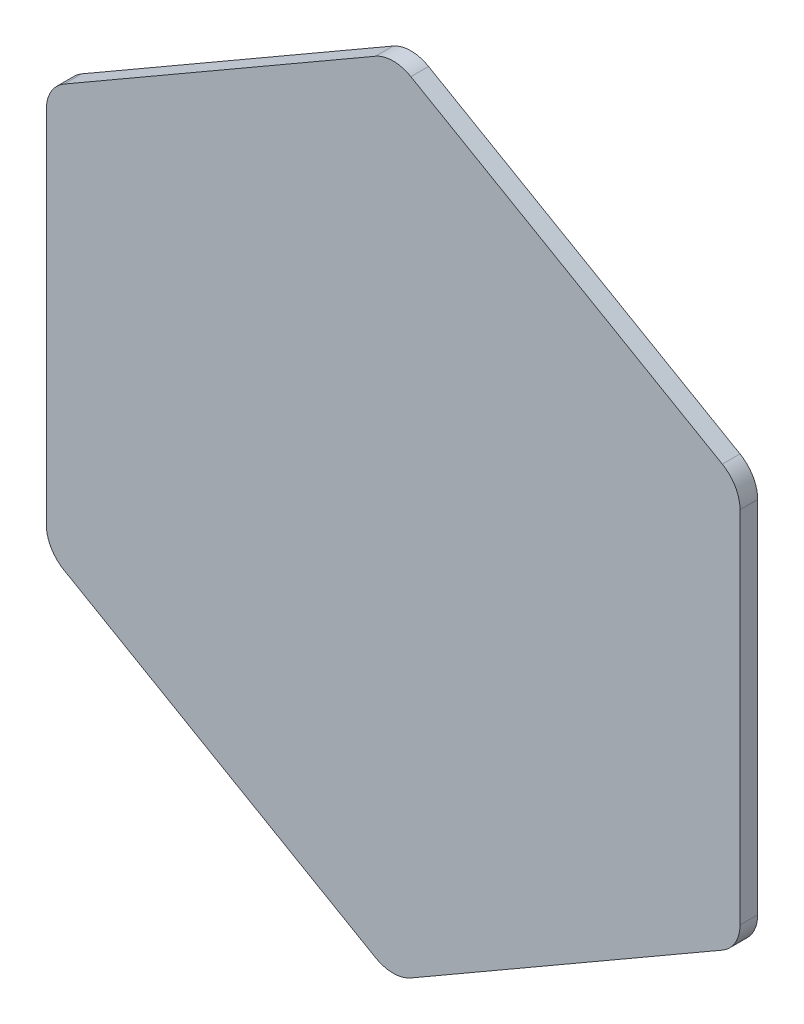
ISO-10303-21;
HEADER;
FILE_DESCRIPTION(('STEP AP214'),'2;1');
FILE_NAME('part.step','',(''),(''),'','','');
FILE_SCHEMA(('AUTOMOTIVE_DESIGN { 1 0 10303 214 1 1 1 1 }'));
ENDSEC;
DATA;
#1=APPLICATION_CONTEXT('core data for automotive mechanical design processes');
#2=APPLICATION_PROTOCOL_DEFINITION('international standard','automotive_design',2000,#1);
#3=PRODUCT_CONTEXT('',#1,'mechanical');
#4=PRODUCT('Part','Part','',(#3));
#5=PRODUCT_RELATED_PRODUCT_CATEGORY('part','',(#4));
#6=PRODUCT_DEFINITION_FORMATION('','',#4);
#7=PRODUCT_DEFINITION_CONTEXT('part definition',#1,'design');
#8=PRODUCT_DEFINITION('design','',#6,#7);
#9=PRODUCT_DEFINITION_SHAPE('','',#8);
#10=(LENGTH_UNIT() NAMED_UNIT(*) SI_UNIT(.MILLI.,.METRE.));
#11=(NAMED_UNIT(*) PLANE_ANGLE_UNIT() SI_UNIT($,.RADIAN.));
#12=(NAMED_UNIT(*) SI_UNIT($,.STERADIAN.) SOLID_ANGLE_UNIT());
#13=UNCERTAINTY_MEASURE_WITH_UNIT(LENGTH_MEASURE(1.E-05),#10,'distance_accuracy_value','');
#14=(GEOMETRIC_REPRESENTATION_CONTEXT(3) GLOBAL_UNCERTAINTY_ASSIGNED_CONTEXT((#13)) GLOBAL_UNIT_ASSIGNED_CONTEXT((#10,
#11,#12)) REPRESENTATION_CONTEXT('',''));
#15=CARTESIAN_POINT('',(0.,0.,0.));
#16=DIRECTION('',(0.,0.,1.));
#17=DIRECTION('',(1.,0.,0.));
#18=AXIS2_PLACEMENT_3D('',#15,#16,#17);
#19=CARTESIAN_POINT('',(0.,0.,0.));
#20=DIRECTION('',(0.,0.,1.));
#21=DIRECTION('',(1.,0.,0.));
#22=AXIS2_PLACEMENT_3D('',#19,#20,#21);
#23=PLANE('',#22);
#24=DIRECTION('',(0.,-1.,0.));
#25=VECTOR('',#24,1.);
#26=CARTESIAN_POINT('',(4.93445489885111,0.,0.));
#27=LINE('',#26,#25);
#28=CARTESIAN_POINT('',(4.93445489885104,6.0297366996516,0.));
#29=VERTEX_POINT('',#28);
#30=CARTESIAN_POINT('',(4.93445489885107,3.13854399058548,0.));
#31=VERTEX_POINT('',#30);
#32=EDGE_CURVE('E255',#29,#31,#27,.T.);
#33=ORIENTED_EDGE('',*,*,#32,.F.);
#34=DIRECTION('',(-0.930801999936379,-0.365523784334806,0.));
#35=VECTOR('',#34,1.);
#36=CARTESIAN_POINT('',(-1.39221808373856,3.54526690800636,0.));
#37=LINE('',#36,#35);
#38=CARTESIAN_POINT('',(-1.55080949137151,3.48298843043009,0.));
#39=VERTEX_POINT('',#38);
#40=EDGE_CURVE('E271',#29,#39,#37,.T.);
#41=ORIENTED_EDGE('',*,*,#40,.T.);
#42=CARTESIAN_POINT('',(0.251075484721764,-1.10549038075091,0.));
#43=DIRECTION('',(0.,0.,1.));
#44=DIRECTION('',(1.,0.,0.));
#45=AXIS2_PLACEMENT_3D('',#42,#43,#44);
#46=CIRCLE('',#45,4.92959706951062);
#47=CARTESIAN_POINT('',(4.03712241839969,2.05152971480054,0.));
#48=VERTEX_POINT('',#47);
#49=EDGE_CURVE('E233',#39,#48,#46,.T.);
#50=ORIENTED_EDGE('',*,*,#49,.T.);
#51=DIRECTION('',(-0.93394817059287,-0.357408470305659,0.));
#52=VECTOR('',#51,1.);
#53=CARTESIAN_POINT('',(-0.169097337099857,0.441870189873999,0.));
#54=LINE('',#53,#52);
#55=CARTESIAN_POINT('',(1.14629572943802,0.945252110375574,0.));
#56=VERTEX_POINT('',#55);
#57=EDGE_CURVE('E95',#48,#56,#54,.T.);
#58=ORIENTED_EDGE('',*,*,#57,.T.);
#59=CARTESIAN_POINT('',(0.262460127323231,-1.10555132052141,0.));
#60=DIRECTION('',(0.,0.,1.));
#61=DIRECTION('',(1.,0.,0.));
#62=AXIS2_PLACEMENT_3D('',#59,#60,#61);
#63=CIRCLE('',#62,2.23315026000144);
#64=CARTESIAN_POINT('',(-0.277756055893655,1.06127275151006,0.));
#65=VERTEX_POINT('',#64);
#66=EDGE_CURVE('E278',#65,#56,#63,.T.);
#67=ORIENTED_EDGE('',*,*,#66,.F.);
#68=DIRECTION('',(-0.928943832980867,-0.37022068441244,0.));
#69=VECTOR('',#68,1.);
#70=CARTESIAN_POINT('',(-0.403056969208098,1.01133540520579,0.));
#71=LINE('',#70,#69);
#72=EDGE_CURVE('E258',#31,#65,#71,.T.);
#73=ORIENTED_EDGE('',*,*,#72,.F.);
#74=EDGE_LOOP('',(#33,#41,#50,#58,#67,#73));
#75=FACE_BOUND('',#74,.T.);
#76=DIRECTION('',(-0.866025403784439,0.5,0.));
#77=VECTOR('',#76,1.);
#78=CARTESIAN_POINT('',(9.80340757083983,5.66,0.));
#79=LINE('',#78,#77);
#80=CARTESIAN_POINT('',(9.30340757083983,5.94867513459482,0.));
#81=VERTEX_POINT('',#80);
#82=CARTESIAN_POINT('',(0.499999999999999,11.0313248654052,0.));
#83=VERTEX_POINT('',#82);
#84=EDGE_CURVE('E330',#81,#83,#79,.T.);
#85=ORIENTED_EDGE('',*,*,#84,.F.);
#86=CARTESIAN_POINT('',(8.80340757083983,5.08264973081038,0.));
#87=DIRECTION('',(0.,0.,1.));
#88=DIRECTION('',(1.,0.,0.));
#89=AXIS2_PLACEMENT_3D('',#86,#87,#88);
#90=CIRCLE('',#89,1.);
#91=CARTESIAN_POINT('',(9.80340757083983,5.08264973081038,0.));
#92=VERTEX_POINT('',#91);
#93=EDGE_CURVE('E411',#81,#92,#90,.F.);
#94=ORIENTED_EDGE('',*,*,#93,.T.);
#95=DIRECTION('',(0.,1.,0.));
#96=VECTOR('',#95,1.);
#97=CARTESIAN_POINT('',(9.80340757083983,-5.65999999999999,0.));
#98=LINE('',#97,#96);
#99=CARTESIAN_POINT('',(9.80340757083983,-5.08264973081036,0.));
#100=VERTEX_POINT('',#99);
#101=EDGE_CURVE('E347',#100,#92,#98,.T.);
#102=ORIENTED_EDGE('',*,*,#101,.F.);
#103=CARTESIAN_POINT('',(8.80340757083983,-5.08264973081036,0.));
#104=DIRECTION('',(0.,0.,1.));
#105=DIRECTION('',(1.,0.,0.));
#106=AXIS2_PLACEMENT_3D('',#103,#104,#105);
#107=CIRCLE('',#106,1.);
#108=CARTESIAN_POINT('',(9.30340757083983,-5.9486751345948,0.));
#109=VERTEX_POINT('',#108);
#110=EDGE_CURVE('E408',#100,#109,#107,.F.);
#111=ORIENTED_EDGE('',*,*,#110,.T.);
#112=DIRECTION('',(0.866025403784439,0.5,0.));
#113=VECTOR('',#112,1.);
#114=CARTESIAN_POINT('',(0.,-11.32,0.));
#115=LINE('',#114,#113);
#116=CARTESIAN_POINT('',(0.499999999999987,-11.0313248654052,0.));
#117=VERTEX_POINT('',#116);
#118=EDGE_CURVE('E383',#117,#109,#115,.T.);
#119=ORIENTED_EDGE('',*,*,#118,.F.);
#120=CARTESIAN_POINT('',(0.,-10.1652994616207,0.));
#121=DIRECTION('',(0.,0.,1.));
#122=DIRECTION('',(1.,0.,0.));
#123=AXIS2_PLACEMENT_3D('',#120,#121,#122);
#124=CIRCLE('',#123,1.);
#125=CARTESIAN_POINT('',(-0.500000000000016,-11.0313248654052,0.));
#126=VERTEX_POINT('',#125);
#127=EDGE_CURVE('E405',#117,#126,#124,.F.);
#128=ORIENTED_EDGE('',*,*,#127,.T.);
#129=DIRECTION('',(0.866025403784438,-0.5,0.));
#130=VECTOR('',#129,1.);
#131=CARTESIAN_POINT('',(-9.80340757083984,-5.65999999999999,0.));
#132=LINE('',#131,#130);
#133=CARTESIAN_POINT('',(-9.30340757083984,-5.94867513459481,0.));
#134=VERTEX_POINT('',#133);
#135=EDGE_CURVE('E379',#134,#126,#132,.T.);
#136=ORIENTED_EDGE('',*,*,#135,.F.);
#137=CARTESIAN_POINT('',(-8.80340757083984,-5.08264973081037,0.));
#138=DIRECTION('',(0.,0.,1.));
#139=DIRECTION('',(1.,0.,0.));
#140=AXIS2_PLACEMENT_3D('',#137,#138,#139);
#141=CIRCLE('',#140,1.);
#142=CARTESIAN_POINT('',(-9.80340757083984,-5.08264973081037,0.));
#143=VERTEX_POINT('',#142);
#144=EDGE_CURVE('E402',#134,#143,#141,.F.);
#145=ORIENTED_EDGE('',*,*,#144,.T.);
#146=DIRECTION('',(0.,-1.,0.));
#147=VECTOR('',#146,1.);
#148=CARTESIAN_POINT('',(-9.80340757083984,5.66,0.));
#149=LINE('',#148,#147);
#150=CARTESIAN_POINT('',(-9.80340757083984,5.08264973081037,0.));
#151=VERTEX_POINT('',#150);
#152=EDGE_CURVE('E375',#151,#143,#149,.T.);
#153=ORIENTED_EDGE('',*,*,#152,.F.);
#154=CARTESIAN_POINT('',(-8.80340757083984,5.08264973081037,0.));
#155=DIRECTION('',(0.,0.,1.));
#156=DIRECTION('',(1.,0.,0.));
#157=AXIS2_PLACEMENT_3D('',#154,#155,#156);
#158=CIRCLE('',#157,1.);
#159=CARTESIAN_POINT('',(-9.30340757083984,5.94867513459481,0.));
#160=VERTEX_POINT('',#159);
#161=EDGE_CURVE('E399',#151,#160,#158,.F.);
#162=ORIENTED_EDGE('',*,*,#161,.T.);
#163=DIRECTION('',(-0.866025403784439,-0.5,0.));
#164=VECTOR('',#163,1.);
#165=CARTESIAN_POINT('',(0.,11.32,0.));
#166=LINE('',#165,#164);
#167=CARTESIAN_POINT('',(-0.500000000000001,11.0313248654052,0.));
#168=VERTEX_POINT('',#167);
#169=EDGE_CURVE('E371',#168,#160,#166,.T.);
#170=ORIENTED_EDGE('',*,*,#169,.F.);
#171=CARTESIAN_POINT('',(0.,10.1652994616207,0.));
#172=DIRECTION('',(0.,0.,1.));
#173=DIRECTION('',(1.,0.,0.));
#174=AXIS2_PLACEMENT_3D('',#171,#172,#173);
#175=CIRCLE('',#174,1.);
#176=EDGE_CURVE('E396',#168,#83,#175,.F.);
#177=ORIENTED_EDGE('',*,*,#176,.T.);
#178=EDGE_LOOP('',(#85,#94,#102,#111,#119,#128,#136,#145,#153,#162,#170,#177));
#179=FACE_BOUND('',#178,.T.);
#180=CARTESIAN_POINT('',(1.50162423897402,-2.72281707378858,0.));
#181=DIRECTION('',(0.,0.,1.));
#182=DIRECTION('',(1.,0.,0.));
#183=AXIS2_PLACEMENT_3D('',#180,#181,#182);
#184=CIRCLE('',#183,7.6439857574976);
#185=CARTESIAN_POINT('',(-0.705543929440594,4.59557939928961,0.));
#186=VERTEX_POINT('',#185);
#187=CARTESIAN_POINT('',(-3.71178768308495,2.86742928856073,0.));
#188=VERTEX_POINT('',#187);
#189=EDGE_CURVE('E286',#186,#188,#184,.T.);
#190=ORIENTED_EDGE('',*,*,#189,.F.);
#191=DIRECTION('',(0.93075351304519,-0.36564723156895,0.));
#192=VECTOR('',#191,1.);
#193=CARTESIAN_POINT('',(1.46967205643605,3.74104413065754,0.));
#194=LINE('',#193,#192);
#195=CARTESIAN_POINT('',(-6.66156274128962,6.93540595831056,0.));
#196=VERTEX_POINT('',#195);
#197=EDGE_CURVE('E317',#196,#186,#194,.T.);
#198=ORIENTED_EDGE('',*,*,#197,.F.);
#199=DIRECTION('',(0.,1.,0.));
#200=VECTOR('',#199,1.);
#201=CARTESIAN_POINT('',(-6.66156274128962,0.,0.));
#202=LINE('',#201,#200);
#203=CARTESIAN_POINT('',(-6.66156274128962,4.02625068291126,0.));
#204=VERTEX_POINT('',#203);
#205=EDGE_CURVE('E321',#204,#196,#202,.T.);
#206=ORIENTED_EDGE('',*,*,#205,.F.);
#207=DIRECTION('',(0.93075351304519,-0.365647231568951,0.));
#208=VECTOR('',#207,1.);
#209=CARTESIAN_POINT('',(0.479606673525878,1.22083680040102,0.));
#210=LINE('',#209,#208);
#211=EDGE_CURVE('E103',#204,#188,#210,.T.);
#212=ORIENTED_EDGE('',*,*,#211,.T.);
#213=EDGE_LOOP('',(#190,#198,#206,#212));
#214=FACE_BOUND('',#213,.T.);
#215=ADVANCED_FACE('F79',(#75,#179,#214),#23,.F.);
#216=CARTESIAN_POINT('',(9.80340757083983,5.66,0.5));
#217=DIRECTION('',(-0.5,-0.866025403784439,0.));
#218=DIRECTION('',(0.866025403784439,-0.5,0.));
#219=AXIS2_PLACEMENT_3D('',#216,#217,#218);
#220=PLANE('',#219);
#221=DIRECTION('',(-0.866025403784439,0.5,0.));
#222=VECTOR('',#221,1.);
#223=CARTESIAN_POINT('',(9.80340757083983,5.66,0.5));
#224=LINE('',#223,#222);
#225=CARTESIAN_POINT('',(9.30340757083983,5.94867513459482,0.5));
#226=VERTEX_POINT('',#225);
#227=CARTESIAN_POINT('',(0.499999999999999,11.0313248654052,0.5));
#228=VERTEX_POINT('',#227);
#229=EDGE_CURVE('E342',#226,#228,#224,.T.);
#230=ORIENTED_EDGE('',*,*,#229,.F.);
#231=DIRECTION('',(0.,0.,-1.));
#232=VECTOR('',#231,1.);
#233=CARTESIAN_POINT('',(9.30340757083983,5.94867513459482,0.5));
#234=LINE('',#233,#232);
#235=EDGE_CURVE('E392',#226,#81,#234,.T.);
#236=ORIENTED_EDGE('',*,*,#235,.T.);
#237=ORIENTED_EDGE('',*,*,#84,.T.);
#238=DIRECTION('',(0.,0.,-1.));
#239=VECTOR('',#238,1.);
#240=CARTESIAN_POINT('',(0.499999999999999,11.0313248654052,0.5));
#241=LINE('',#240,#239);
#242=EDGE_CURVE('E367',#83,#228,#241,.F.);
#243=ORIENTED_EDGE('',*,*,#242,.T.);
#244=EDGE_LOOP('',(#230,#236,#237,#243));
#245=FACE_BOUND('',#244,.T.);
#246=ADVANCED_FACE('F515',(#245),#220,.F.);
#247=CARTESIAN_POINT('',(0.,11.32,0.5));
#248=DIRECTION('',(0.5,-0.866025403784439,0.));
#249=DIRECTION('',(0.866025403784439,0.5,0.));
#250=AXIS2_PLACEMENT_3D('',#247,#248,#249);
#251=PLANE('',#250);
#252=ORIENTED_EDGE('',*,*,#169,.T.);
#253=DIRECTION('',(0.,0.,-1.));
#254=VECTOR('',#253,1.);
#255=CARTESIAN_POINT('',(-9.30340757083984,5.94867513459481,0.5));
#256=LINE('',#255,#254);
#257=CARTESIAN_POINT('',(-9.30340757083984,5.94867513459481,0.5));
#258=VERTEX_POINT('',#257);
#259=EDGE_CURVE('E12',#160,#258,#256,.F.);
#260=ORIENTED_EDGE('',*,*,#259,.T.);
#261=DIRECTION('',(-0.866025403784439,-0.5,0.));
#262=VECTOR('',#261,1.);
#263=CARTESIAN_POINT('',(0.,11.32,0.5));
#264=LINE('',#263,#262);
#265=CARTESIAN_POINT('',(-0.500000000000001,11.0313248654052,0.5));
#266=VERTEX_POINT('',#265);
#267=EDGE_CURVE('E346',#266,#258,#264,.T.);
#268=ORIENTED_EDGE('',*,*,#267,.F.);
#269=DIRECTION('',(0.,0.,-1.));
#270=VECTOR('',#269,1.);
#271=CARTESIAN_POINT('',(-0.500000000000001,11.0313248654052,0.5));
#272=LINE('',#271,#270);
#273=EDGE_CURVE('E88',#266,#168,#272,.T.);
#274=ORIENTED_EDGE('',*,*,#273,.T.);
#275=EDGE_LOOP('',(#252,#260,#268,#274));
#276=FACE_BOUND('',#275,.T.);
#277=ADVANCED_FACE('F465',(#276),#251,.F.);
#278=CARTESIAN_POINT('',(-9.80340757083984,5.66,0.5));
#279=DIRECTION('',(1.,0.,0.));
#280=DIRECTION('',(0.,0.,-1.));
#281=AXIS2_PLACEMENT_3D('',#278,#279,#280);
#282=PLANE('',#281);
#283=ORIENTED_EDGE('',*,*,#152,.T.);
#284=DIRECTION('',(0.,0.,-1.));
#285=VECTOR('',#284,1.);
#286=CARTESIAN_POINT('',(-9.80340757083984,-5.08264973081037,0.5));
#287=LINE('',#286,#285);
#288=CARTESIAN_POINT('',(-9.80340757083984,-5.08264973081037,0.5));
#289=VERTEX_POINT('',#288);
#290=EDGE_CURVE('E457',#143,#289,#287,.F.);
#291=ORIENTED_EDGE('',*,*,#290,.T.);
#292=DIRECTION('',(0.,-1.,0.));
#293=VECTOR('',#292,1.);
#294=CARTESIAN_POINT('',(-9.80340757083984,5.66,0.5));
#295=LINE('',#294,#293);
#296=CARTESIAN_POINT('',(-9.80340757083984,5.08264973081037,0.5));
#297=VERTEX_POINT('',#296);
#298=EDGE_CURVE('E351',#297,#289,#295,.T.);
#299=ORIENTED_EDGE('',*,*,#298,.F.);
#300=DIRECTION('',(0.,0.,-1.));
#301=VECTOR('',#300,1.);
#302=CARTESIAN_POINT('',(-9.80340757083984,5.08264973081037,0.5));
#303=LINE('',#302,#301);
#304=EDGE_CURVE('E453',#297,#151,#303,.T.);
#305=ORIENTED_EDGE('',*,*,#304,.T.);
#306=EDGE_LOOP('',(#283,#291,#299,#305));
#307=FACE_BOUND('',#306,.T.);
#308=ADVANCED_FACE('F478',(#307),#282,.F.);
#309=CARTESIAN_POINT('',(-9.80340757083984,-5.65999999999999,0.5));
#310=DIRECTION('',(0.5,0.866025403784439,0.));
#311=DIRECTION('',(-0.866025403784439,0.5,0.));
#312=AXIS2_PLACEMENT_3D('',#309,#310,#311);
#313=PLANE('',#312);
#314=ORIENTED_EDGE('',*,*,#135,.T.);
#315=DIRECTION('',(0.,0.,-1.));
#316=VECTOR('',#315,1.);
#317=CARTESIAN_POINT('',(-0.500000000000013,-11.0313248654052,0.5));
#318=LINE('',#317,#316);
#319=CARTESIAN_POINT('',(-0.500000000000016,-11.0313248654052,0.5));
#320=VERTEX_POINT('',#319);
#321=EDGE_CURVE('E450',#126,#320,#318,.F.);
#322=ORIENTED_EDGE('',*,*,#321,.T.);
#323=DIRECTION('',(0.866025403784438,-0.5,0.));
#324=VECTOR('',#323,1.);
#325=CARTESIAN_POINT('',(-9.80340757083984,-5.65999999999999,0.5));
#326=LINE('',#325,#324);
#327=CARTESIAN_POINT('',(-9.30340757083984,-5.94867513459481,0.5));
#328=VERTEX_POINT('',#327);
#329=EDGE_CURVE('E355',#328,#320,#326,.T.);
#330=ORIENTED_EDGE('',*,*,#329,.F.);
#331=DIRECTION('',(0.,0.,-1.));
#332=VECTOR('',#331,1.);
#333=CARTESIAN_POINT('',(-9.30340757083984,-5.94867513459481,0.5));
#334=LINE('',#333,#332);
#335=EDGE_CURVE('E446',#328,#134,#334,.T.);
#336=ORIENTED_EDGE('',*,*,#335,.T.);
#337=EDGE_LOOP('',(#314,#322,#330,#336));
#338=FACE_BOUND('',#337,.T.);
#339=ADVANCED_FACE('F489',(#338),#313,.F.);
#340=CARTESIAN_POINT('',(0.,-11.32,0.5));
#341=DIRECTION('',(-0.5,0.866025403784439,0.));
#342=DIRECTION('',(-0.866025403784439,-0.5,0.));
#343=AXIS2_PLACEMENT_3D('',#340,#341,#342);
#344=PLANE('',#343);
#345=ORIENTED_EDGE('',*,*,#118,.T.);
#346=DIRECTION('',(0.,0.,-1.));
#347=VECTOR('',#346,1.);
#348=CARTESIAN_POINT('',(9.30340757083983,-5.9486751345948,0.5));
#349=LINE('',#348,#347);
#350=CARTESIAN_POINT('',(9.30340757083983,-5.9486751345948,0.5));
#351=VERTEX_POINT('',#350);
#352=EDGE_CURVE('E443',#109,#351,#349,.F.);
#353=ORIENTED_EDGE('',*,*,#352,.T.);
#354=DIRECTION('',(0.866025403784439,0.5,0.));
#355=VECTOR('',#354,1.);
#356=CARTESIAN_POINT('',(0.,-11.32,0.5));
#357=LINE('',#356,#355);
#358=CARTESIAN_POINT('',(0.499999999999987,-11.0313248654052,0.5));
#359=VERTEX_POINT('',#358);
#360=EDGE_CURVE('E359',#359,#351,#357,.T.);
#361=ORIENTED_EDGE('',*,*,#360,.F.);
#362=DIRECTION('',(0.,0.,-1.));
#363=VECTOR('',#362,1.);
#364=CARTESIAN_POINT('',(0.499999999999987,-11.0313248654052,0.5));
#365=LINE('',#364,#363);
#366=EDGE_CURVE('E439',#359,#117,#365,.T.);
#367=ORIENTED_EDGE('',*,*,#366,.T.);
#368=EDGE_LOOP('',(#345,#353,#361,#367));
#369=FACE_BOUND('',#368,.T.);
#370=ADVANCED_FACE('F498',(#369),#344,.F.);
#371=CARTESIAN_POINT('',(9.80340757083983,-5.65999999999999,0.5));
#372=DIRECTION('',(-1.,0.,0.));
#373=DIRECTION('',(0.,-1.,0.));
#374=AXIS2_PLACEMENT_3D('',#371,#372,#373);
#375=PLANE('',#374);
#376=ORIENTED_EDGE('',*,*,#101,.T.);
#377=DIRECTION('',(0.,0.,-1.));
#378=VECTOR('',#377,1.);
#379=CARTESIAN_POINT('',(9.80340757083983,5.08264973081038,0.5));
#380=LINE('',#379,#378);
#381=CARTESIAN_POINT('',(9.80340757083983,5.08264973081038,0.5));
#382=VERTEX_POINT('',#381);
#383=EDGE_CURVE('E418',#92,#382,#380,.F.);
#384=ORIENTED_EDGE('',*,*,#383,.T.);
#385=DIRECTION('',(0.,1.,0.));
#386=VECTOR('',#385,1.);
#387=CARTESIAN_POINT('',(9.80340757083983,-5.65999999999999,0.5));
#388=LINE('',#387,#386);
#389=CARTESIAN_POINT('',(9.80340757083983,-5.08264973081036,0.5));
#390=VERTEX_POINT('',#389);
#391=EDGE_CURVE('E363',#390,#382,#388,.T.);
#392=ORIENTED_EDGE('',*,*,#391,.F.);
#393=DIRECTION('',(0.,0.,-1.));
#394=VECTOR('',#393,1.);
#395=CARTESIAN_POINT('',(9.80340757083983,-5.08264973081036,0.5));
#396=LINE('',#395,#394);
#397=EDGE_CURVE('E414',#390,#100,#396,.T.);
#398=ORIENTED_EDGE('',*,*,#397,.T.);
#399=EDGE_LOOP('',(#376,#384,#392,#398));
#400=FACE_BOUND('',#399,.T.);
#401=ADVANCED_FACE('F507',(#400),#375,.F.);
#402=CARTESIAN_POINT('',(0.,0.,0.5));
#403=DIRECTION('',(0.,0.,1.));
#404=DIRECTION('',(1.,0.,0.));
#405=AXIS2_PLACEMENT_3D('',#402,#403,#404);
#406=PLANE('',#405);
#407=ORIENTED_EDGE('',*,*,#391,.T.);
#408=CARTESIAN_POINT('',(8.80340757083983,5.08264973081038,0.5));
#409=DIRECTION('',(0.,0.,1.));
#410=DIRECTION('',(1.,0.,0.));
#411=AXIS2_PLACEMENT_3D('',#408,#409,#410);
#412=CIRCLE('',#411,1.);
#413=EDGE_CURVE('E436',#382,#226,#412,.T.);
#414=ORIENTED_EDGE('',*,*,#413,.T.);
#415=ORIENTED_EDGE('',*,*,#229,.T.);
#416=CARTESIAN_POINT('',(0.,10.1652994616207,0.5));
#417=DIRECTION('',(0.,0.,1.));
#418=DIRECTION('',(1.,0.,0.));
#419=AXIS2_PLACEMENT_3D('',#416,#417,#418);
#420=CIRCLE('',#419,1.);
#421=EDGE_CURVE('E421',#228,#266,#420,.T.);
#422=ORIENTED_EDGE('',*,*,#421,.T.);
#423=ORIENTED_EDGE('',*,*,#267,.T.);
#424=CARTESIAN_POINT('',(-8.80340757083984,5.08264973081037,0.5));
#425=DIRECTION('',(0.,0.,1.));
#426=DIRECTION('',(1.,0.,0.));
#427=AXIS2_PLACEMENT_3D('',#424,#425,#426);
#428=CIRCLE('',#427,1.);
#429=EDGE_CURVE('E424',#258,#297,#428,.T.);
#430=ORIENTED_EDGE('',*,*,#429,.T.);
#431=ORIENTED_EDGE('',*,*,#298,.T.);
#432=CARTESIAN_POINT('',(-8.80340757083984,-5.08264973081037,0.5));
#433=DIRECTION('',(0.,0.,1.));
#434=DIRECTION('',(1.,0.,0.));
#435=AXIS2_PLACEMENT_3D('',#432,#433,#434);
#436=CIRCLE('',#435,1.);
#437=EDGE_CURVE('E427',#289,#328,#436,.T.);
#438=ORIENTED_EDGE('',*,*,#437,.T.);
#439=ORIENTED_EDGE('',*,*,#329,.T.);
#440=CARTESIAN_POINT('',(0.,-10.1652994616207,0.5));
#441=DIRECTION('',(0.,0.,1.));
#442=DIRECTION('',(1.,0.,0.));
#443=AXIS2_PLACEMENT_3D('',#440,#441,#442);
#444=CIRCLE('',#443,1.);
#445=EDGE_CURVE('E430',#320,#359,#444,.T.);
#446=ORIENTED_EDGE('',*,*,#445,.T.);
#447=ORIENTED_EDGE('',*,*,#360,.T.);
#448=CARTESIAN_POINT('',(8.80340757083983,-5.08264973081036,0.5));
#449=DIRECTION('',(0.,0.,1.));
#450=DIRECTION('',(1.,0.,0.));
#451=AXIS2_PLACEMENT_3D('',#448,#449,#450);
#452=CIRCLE('',#451,1.);
#453=EDGE_CURVE('E433',#351,#390,#452,.T.);
#454=ORIENTED_EDGE('',*,*,#453,.T.);
#455=EDGE_LOOP('',(#407,#414,#415,#422,#423,#430,#431,#438,#439,#446,#447,#454));
#456=FACE_BOUND('',#455,.T.);
#457=ADVANCED_FACE('F482',(#456),#406,.T.);
#458=CARTESIAN_POINT('',(8.80340757083983,5.08264973081038,0.5));
#459=DIRECTION('',(0.,0.,-1.));
#460=DIRECTION('',(-1.,0.,0.));
#461=AXIS2_PLACEMENT_3D('',#458,#459,#460);
#462=CYLINDRICAL_SURFACE('',#461,1.);
#463=ORIENTED_EDGE('',*,*,#413,.F.);
#464=ORIENTED_EDGE('',*,*,#383,.F.);
#465=ORIENTED_EDGE('',*,*,#93,.F.);
#466=ORIENTED_EDGE('',*,*,#235,.F.);
#467=EDGE_LOOP('',(#463,#464,#465,#466));
#468=FACE_BOUND('',#467,.T.);
#469=ADVANCED_FACE('F512',(#468),#462,.T.);
#470=CARTESIAN_POINT('',(8.80340757083983,-5.08264973081036,0.5));
#471=DIRECTION('',(0.,0.,-1.));
#472=DIRECTION('',(-1.,0.,0.));
#473=AXIS2_PLACEMENT_3D('',#470,#471,#472);
#474=CYLINDRICAL_SURFACE('',#473,1.);
#475=ORIENTED_EDGE('',*,*,#453,.F.);
#476=ORIENTED_EDGE('',*,*,#352,.F.);
#477=ORIENTED_EDGE('',*,*,#110,.F.);
#478=ORIENTED_EDGE('',*,*,#397,.F.);
#479=EDGE_LOOP('',(#475,#476,#477,#478));
#480=FACE_BOUND('',#479,.T.);
#481=ADVANCED_FACE('F504',(#480),#474,.T.);
#482=CARTESIAN_POINT('',(0.,-10.1652994616207,0.5));
#483=DIRECTION('',(0.,0.,-1.));
#484=DIRECTION('',(-1.,0.,0.));
#485=AXIS2_PLACEMENT_3D('',#482,#483,#484);
#486=CYLINDRICAL_SURFACE('',#485,1.);
#487=ORIENTED_EDGE('',*,*,#445,.F.);
#488=ORIENTED_EDGE('',*,*,#321,.F.);
#489=ORIENTED_EDGE('',*,*,#127,.F.);
#490=ORIENTED_EDGE('',*,*,#366,.F.);
#491=EDGE_LOOP('',(#487,#488,#489,#490));
#492=FACE_BOUND('',#491,.T.);
#493=ADVANCED_FACE('F495',(#492),#486,.T.);
#494=CARTESIAN_POINT('',(-8.80340757083984,-5.08264973081037,0.5));
#495=DIRECTION('',(0.,0.,-1.));
#496=DIRECTION('',(-1.,0.,0.));
#497=AXIS2_PLACEMENT_3D('',#494,#495,#496);
#498=CYLINDRICAL_SURFACE('',#497,1.);
#499=ORIENTED_EDGE('',*,*,#437,.F.);
#500=ORIENTED_EDGE('',*,*,#290,.F.);
#501=ORIENTED_EDGE('',*,*,#144,.F.);
#502=ORIENTED_EDGE('',*,*,#335,.F.);
#503=EDGE_LOOP('',(#499,#500,#501,#502));
#504=FACE_BOUND('',#503,.T.);
#505=ADVANCED_FACE('F486',(#504),#498,.T.);
#506=CARTESIAN_POINT('',(-8.80340757083984,5.08264973081037,0.5));
#507=DIRECTION('',(0.,0.,-1.));
#508=DIRECTION('',(-1.,0.,0.));
#509=AXIS2_PLACEMENT_3D('',#506,#507,#508);
#510=CYLINDRICAL_SURFACE('',#509,1.);
#511=ORIENTED_EDGE('',*,*,#429,.F.);
#512=ORIENTED_EDGE('',*,*,#259,.F.);
#513=ORIENTED_EDGE('',*,*,#161,.F.);
#514=ORIENTED_EDGE('',*,*,#304,.F.);
#515=EDGE_LOOP('',(#511,#512,#513,#514));
#516=FACE_BOUND('',#515,.T.);
#517=ADVANCED_FACE('F475',(#516),#510,.T.);
#518=CARTESIAN_POINT('',(0.,10.1652994616207,0.5));
#519=DIRECTION('',(0.,0.,-1.));
#520=DIRECTION('',(-1.,0.,0.));
#521=AXIS2_PLACEMENT_3D('',#518,#519,#520);
#522=CYLINDRICAL_SURFACE('',#521,1.);
#523=ORIENTED_EDGE('',*,*,#421,.F.);
#524=ORIENTED_EDGE('',*,*,#242,.F.);
#525=ORIENTED_EDGE('',*,*,#176,.F.);
#526=ORIENTED_EDGE('',*,*,#273,.F.);
#527=EDGE_LOOP('',(#523,#524,#525,#526));
#528=FACE_BOUND('',#527,.T.);
#529=ADVANCED_FACE('F81',(#528),#522,.T.);
#530=CARTESIAN_POINT('',(1.50162423897402,-2.72281707378858,-0.5));
#531=DIRECTION('',(0.,0.,1.));
#532=DIRECTION('',(1.,0.,0.));
#533=AXIS2_PLACEMENT_3D('',#530,#531,#532);
#534=CYLINDRICAL_SURFACE('',#533,7.6439857574976);
#535=ORIENTED_EDGE('',*,*,#189,.T.);
#536=DIRECTION('',(0.,0.,1.));
#537=VECTOR('',#536,1.);
#538=CARTESIAN_POINT('',(-3.71178768308495,2.86742928856073,-0.5));
#539=LINE('',#538,#537);
#540=CARTESIAN_POINT('',(-3.71178768308495,2.86742928856073,-0.5));
#541=VERTEX_POINT('',#540);
#542=EDGE_CURVE('E327',#541,#188,#539,.T.);
#543=ORIENTED_EDGE('',*,*,#542,.F.);
#544=CARTESIAN_POINT('',(1.50162423897402,-2.72281707378858,-0.5));
#545=DIRECTION('',(0.,0.,1.));
#546=DIRECTION('',(1.,0.,0.));
#547=AXIS2_PLACEMENT_3D('',#544,#545,#546);
#548=CIRCLE('',#547,7.6439857574976);
#549=CARTESIAN_POINT('',(-0.705543929440594,4.59557939928961,-0.5));
#550=VERTEX_POINT('',#549);
#551=EDGE_CURVE('E300',#550,#541,#548,.T.);
#552=ORIENTED_EDGE('',*,*,#551,.F.);
#553=DIRECTION('',(0.,0.,1.));
#554=VECTOR('',#553,1.);
#555=CARTESIAN_POINT('',(-0.705543929440594,4.59557939928961,-0.5));
#556=LINE('',#555,#554);
#557=EDGE_CURVE('E313',#550,#186,#556,.T.);
#558=ORIENTED_EDGE('',*,*,#557,.T.);
#559=EDGE_LOOP('',(#535,#543,#552,#558));
#560=FACE_BOUND('',#559,.T.);
#561=ADVANCED_FACE('F518',(#560),#534,.F.);
#562=CARTESIAN_POINT('',(0.479606673525878,1.22083680040102,-0.5));
#563=DIRECTION('',(-0.365647231568951,-0.930753513045189,0.));
#564=DIRECTION('',(0.93075351304519,-0.365647231568951,0.));
#565=AXIS2_PLACEMENT_3D('',#562,#563,#564);
#566=PLANE('',#565);
#567=ORIENTED_EDGE('',*,*,#211,.F.);
#568=DIRECTION('',(0.,0.,1.));
#569=VECTOR('',#568,1.);
#570=CARTESIAN_POINT('',(-6.66156274128962,4.02625068291126,-0.5));
#571=LINE('',#570,#569);
#572=CARTESIAN_POINT('',(-6.66156274128962,4.02625068291126,-0.5));
#573=VERTEX_POINT('',#572);
#574=EDGE_CURVE('E331',#573,#204,#571,.T.);
#575=ORIENTED_EDGE('',*,*,#574,.F.);
#576=DIRECTION('',(0.93075351304519,-0.365647231568951,0.));
#577=VECTOR('',#576,1.);
#578=CARTESIAN_POINT('',(0.479606673525878,1.22083680040102,-0.5));
#579=LINE('',#578,#577);
#580=EDGE_CURVE('E309',#573,#541,#579,.T.);
#581=ORIENTED_EDGE('',*,*,#580,.T.);
#582=ORIENTED_EDGE('',*,*,#542,.T.);
#583=EDGE_LOOP('',(#567,#575,#581,#582));
#584=FACE_BOUND('',#583,.T.);
#585=ADVANCED_FACE('F524',(#584),#566,.T.);
#586=CARTESIAN_POINT('',(-6.66156274128962,0.,-0.5));
#587=DIRECTION('',(1.,0.,0.));
#588=DIRECTION('',(0.,0.,-1.));
#589=AXIS2_PLACEMENT_3D('',#586,#587,#588);
#590=PLANE('',#589);
#591=ORIENTED_EDGE('',*,*,#205,.T.);
#592=DIRECTION('',(0.,0.,1.));
#593=VECTOR('',#592,1.);
#594=CARTESIAN_POINT('',(-6.66156274128962,6.93540595831056,-0.5));
#595=LINE('',#594,#593);
#596=CARTESIAN_POINT('',(-6.66156274128962,6.93540595831056,-0.5));
#597=VERTEX_POINT('',#596);
#598=EDGE_CURVE('E335',#597,#196,#595,.T.);
#599=ORIENTED_EDGE('',*,*,#598,.F.);
#600=DIRECTION('',(0.,1.,0.));
#601=VECTOR('',#600,1.);
#602=CARTESIAN_POINT('',(-6.66156274128962,0.,-0.5));
#603=LINE('',#602,#601);
#604=EDGE_CURVE('E306',#573,#597,#603,.T.);
#605=ORIENTED_EDGE('',*,*,#604,.F.);
#606=ORIENTED_EDGE('',*,*,#574,.T.);
#607=EDGE_LOOP('',(#591,#599,#605,#606));
#608=FACE_BOUND('',#607,.T.);
#609=ADVANCED_FACE('F591',(#608),#590,.F.);
#610=CARTESIAN_POINT('',(1.46967205643605,3.74104413065754,-0.5));
#611=DIRECTION('',(-0.36564723156895,-0.93075351304519,0.));
#612=DIRECTION('',(0.93075351304519,-0.36564723156895,0.));
#613=AXIS2_PLACEMENT_3D('',#610,#611,#612);
#614=PLANE('',#613);
#615=ORIENTED_EDGE('',*,*,#197,.T.);
#616=ORIENTED_EDGE('',*,*,#557,.F.);
#617=DIRECTION('',(0.93075351304519,-0.36564723156895,0.));
#618=VECTOR('',#617,1.);
#619=CARTESIAN_POINT('',(1.46967205643605,3.74104413065754,-0.5));
#620=LINE('',#619,#618);
#621=EDGE_CURVE('E303',#597,#550,#620,.T.);
#622=ORIENTED_EDGE('',*,*,#621,.F.);
#623=ORIENTED_EDGE('',*,*,#598,.T.);
#624=EDGE_LOOP('',(#615,#616,#622,#623));
#625=FACE_BOUND('',#624,.T.);
#626=ADVANCED_FACE('F603',(#625),#614,.F.);
#627=CARTESIAN_POINT('',(0.,0.,-0.5));
#628=DIRECTION('',(0.,0.,1.));
#629=DIRECTION('',(1.,0.,0.));
#630=AXIS2_PLACEMENT_3D('',#627,#628,#629);
#631=PLANE('',#630);
#632=ORIENTED_EDGE('',*,*,#551,.T.);
#633=ORIENTED_EDGE('',*,*,#580,.F.);
#634=ORIENTED_EDGE('',*,*,#604,.T.);
#635=ORIENTED_EDGE('',*,*,#621,.T.);
#636=EDGE_LOOP('',(#632,#633,#634,#635));
#637=FACE_BOUND('',#636,.T.);
#638=ADVANCED_FACE('F615',(#637),#631,.F.);
#639=CARTESIAN_POINT('',(-1.39221808373856,3.54526690800636,-0.5));
#640=DIRECTION('',(-0.365523784334806,0.930801999936379,0.));
#641=DIRECTION('',(-0.930801999936379,-0.365523784334806,0.));
#642=AXIS2_PLACEMENT_3D('',#639,#640,#641);
#643=PLANE('',#642);
#644=ORIENTED_EDGE('',*,*,#40,.F.);
#645=DIRECTION('',(0.,0.,1.));
#646=VECTOR('',#645,1.);
#647=CARTESIAN_POINT('',(4.93445489885104,6.0297366996516,-0.5));
#648=LINE('',#647,#646);
#649=CARTESIAN_POINT('',(4.93445489885104,6.0297366996516,-0.5));
#650=VERTEX_POINT('',#649);
#651=EDGE_CURVE('E252',#650,#29,#648,.T.);
#652=ORIENTED_EDGE('',*,*,#651,.F.);
#653=DIRECTION('',(-0.930801999936379,-0.365523784334806,0.));
#654=VECTOR('',#653,1.);
#655=CARTESIAN_POINT('',(-1.39221808373856,3.54526690800636,-0.5));
#656=LINE('',#655,#654);
#657=CARTESIAN_POINT('',(-1.55080949137151,3.48298843043009,-0.5));
#658=VERTEX_POINT('',#657);
#659=EDGE_CURVE('E246',#650,#658,#656,.T.);
#660=ORIENTED_EDGE('',*,*,#659,.T.);
#661=DIRECTION('',(0.,0.,1.));
#662=VECTOR('',#661,1.);
#663=CARTESIAN_POINT('',(-1.55080949137151,3.48298843043009,-0.5));
#664=LINE('',#663,#662);
#665=EDGE_CURVE('E228',#658,#39,#664,.T.);
#666=ORIENTED_EDGE('',*,*,#665,.T.);
#667=EDGE_LOOP('',(#644,#652,#660,#666));
#668=FACE_BOUND('',#667,.T.);
#669=ADVANCED_FACE('F251',(#668),#643,.T.);
#670=CARTESIAN_POINT('',(4.93445489885111,0.,-0.5));
#671=DIRECTION('',(-1.,0.,0.));
#672=DIRECTION('',(0.,-1.,0.));
#673=AXIS2_PLACEMENT_3D('',#670,#671,#672);
#674=PLANE('',#673);
#675=ORIENTED_EDGE('',*,*,#32,.T.);
#676=DIRECTION('',(0.,0.,1.));
#677=VECTOR('',#676,1.);
#678=CARTESIAN_POINT('',(4.93445489885107,3.13854399058548,-0.5));
#679=LINE('',#678,#677);
#680=CARTESIAN_POINT('',(4.93445489885107,3.13854399058548,-0.5));
#681=VERTEX_POINT('',#680);
#682=EDGE_CURVE('E287',#681,#31,#679,.T.);
#683=ORIENTED_EDGE('',*,*,#682,.F.);
#684=DIRECTION('',(0.,-1.,0.));
#685=VECTOR('',#684,1.);
#686=CARTESIAN_POINT('',(4.93445489885111,0.,-0.5));
#687=LINE('',#686,#685);
#688=EDGE_CURVE('E240',#650,#681,#687,.T.);
#689=ORIENTED_EDGE('',*,*,#688,.F.);
#690=ORIENTED_EDGE('',*,*,#651,.T.);
#691=EDGE_LOOP('',(#675,#683,#689,#690));
#692=FACE_BOUND('',#691,.T.);
#693=ADVANCED_FACE('F638',(#692),#674,.F.);
#694=CARTESIAN_POINT('',(-0.403056969208098,1.01133540520579,-0.5));
#695=DIRECTION('',(-0.37022068441244,0.928943832980867,0.));
#696=DIRECTION('',(-0.928943832980867,-0.37022068441244,0.));
#697=AXIS2_PLACEMENT_3D('',#694,#695,#696);
#698=PLANE('',#697);
#699=ORIENTED_EDGE('',*,*,#72,.T.);
#700=DIRECTION('',(0.,0.,1.));
#701=VECTOR('',#700,1.);
#702=CARTESIAN_POINT('',(-0.277756055893655,1.06127275151006,-0.5));
#703=LINE('',#702,#701);
#704=CARTESIAN_POINT('',(-0.277756055893655,1.06127275151006,-0.5));
#705=VERTEX_POINT('',#704);
#706=EDGE_CURVE('E291',#705,#65,#703,.T.);
#707=ORIENTED_EDGE('',*,*,#706,.F.);
#708=DIRECTION('',(-0.928943832980867,-0.37022068441244,0.));
#709=VECTOR('',#708,1.);
#710=CARTESIAN_POINT('',(-0.403056969208098,1.01133540520579,-0.5));
#711=LINE('',#710,#709);
#712=EDGE_CURVE('E266',#681,#705,#711,.T.);
#713=ORIENTED_EDGE('',*,*,#712,.F.);
#714=ORIENTED_EDGE('',*,*,#682,.T.);
#715=EDGE_LOOP('',(#699,#707,#713,#714));
#716=FACE_BOUND('',#715,.T.);
#717=ADVANCED_FACE('F652',(#716),#698,.F.);
#718=CARTESIAN_POINT('',(0.262460127323231,-1.10555132052141,-0.5));
#719=DIRECTION('',(0.,0.,1.));
#720=DIRECTION('',(1.,0.,0.));
#721=AXIS2_PLACEMENT_3D('',#718,#719,#720);
#722=CYLINDRICAL_SURFACE('',#721,2.23315026000144);
#723=ORIENTED_EDGE('',*,*,#66,.T.);
#724=DIRECTION('',(0.,0.,1.));
#725=VECTOR('',#724,1.);
#726=CARTESIAN_POINT('',(1.14629572943802,0.945252110375574,-0.5));
#727=LINE('',#726,#725);
#728=CARTESIAN_POINT('',(1.14629572943802,0.945252110375574,-0.5));
#729=VERTEX_POINT('',#728);
#730=EDGE_CURVE('E295',#729,#56,#727,.T.);
#731=ORIENTED_EDGE('',*,*,#730,.F.);
#732=CARTESIAN_POINT('',(0.262460127323231,-1.10555132052141,-0.5));
#733=DIRECTION('',(0.,0.,1.));
#734=DIRECTION('',(1.,0.,0.));
#735=AXIS2_PLACEMENT_3D('',#732,#733,#734);
#736=CIRCLE('',#735,2.23315026000144);
#737=EDGE_CURVE('E263',#705,#729,#736,.T.);
#738=ORIENTED_EDGE('',*,*,#737,.F.);
#739=ORIENTED_EDGE('',*,*,#706,.T.);
#740=EDGE_LOOP('',(#723,#731,#738,#739));
#741=FACE_BOUND('',#740,.T.);
#742=ADVANCED_FACE('F664',(#741),#722,.F.);
#743=CARTESIAN_POINT('',(-0.169097337099857,0.441870189873999,-0.5));
#744=DIRECTION('',(-0.357408470305659,0.93394817059287,0.));
#745=DIRECTION('',(-0.93394817059287,-0.357408470305659,0.));
#746=AXIS2_PLACEMENT_3D('',#743,#744,#745);
#747=PLANE('',#746);
#748=ORIENTED_EDGE('',*,*,#57,.F.);
#749=DIRECTION('',(0.,0.,1.));
#750=VECTOR('',#749,1.);
#751=CARTESIAN_POINT('',(4.03712241839969,2.05152971480054,-0.5));
#752=LINE('',#751,#750);
#753=CARTESIAN_POINT('',(4.03712241839969,2.05152971480054,-0.5));
#754=VERTEX_POINT('',#753);
#755=EDGE_CURVE('E239',#754,#48,#752,.T.);
#756=ORIENTED_EDGE('',*,*,#755,.F.);
#757=DIRECTION('',(-0.93394817059287,-0.357408470305659,0.));
#758=VECTOR('',#757,1.);
#759=CARTESIAN_POINT('',(-0.169097337099857,0.441870189873999,-0.5));
#760=LINE('',#759,#758);
#761=EDGE_CURVE('E248',#754,#729,#760,.T.);
#762=ORIENTED_EDGE('',*,*,#761,.T.);
#763=ORIENTED_EDGE('',*,*,#730,.T.);
#764=EDGE_LOOP('',(#748,#756,#762,#763));
#765=FACE_BOUND('',#764,.T.);
#766=ADVANCED_FACE('F679',(#765),#747,.T.);
#767=CARTESIAN_POINT('',(0.251075484721764,-1.10549038075091,-0.5));
#768=DIRECTION('',(0.,0.,1.));
#769=DIRECTION('',(1.,0.,0.));
#770=AXIS2_PLACEMENT_3D('',#767,#768,#769);
#771=CYLINDRICAL_SURFACE('',#770,4.92959706951062);
#772=ORIENTED_EDGE('',*,*,#49,.F.);
#773=ORIENTED_EDGE('',*,*,#665,.F.);
#774=CARTESIAN_POINT('',(0.251075484721764,-1.10549038075091,-0.5));
#775=DIRECTION('',(0.,0.,1.));
#776=DIRECTION('',(1.,0.,0.));
#777=AXIS2_PLACEMENT_3D('',#774,#775,#776);
#778=CIRCLE('',#777,4.92959706951062);
#779=EDGE_CURVE('E231',#658,#754,#778,.T.);
#780=ORIENTED_EDGE('',*,*,#779,.T.);
#781=ORIENTED_EDGE('',*,*,#755,.T.);
#782=EDGE_LOOP('',(#772,#773,#780,#781));
#783=FACE_BOUND('',#782,.T.);
#784=ADVANCED_FACE('F230',(#783),#771,.T.);
#785=CARTESIAN_POINT('',(0.,0.,-0.5));
#786=DIRECTION('',(0.,0.,1.));
#787=DIRECTION('',(1.,0.,0.));
#788=AXIS2_PLACEMENT_3D('',#785,#786,#787);
#789=PLANE('',#788);
#790=ORIENTED_EDGE('',*,*,#659,.F.);
#791=ORIENTED_EDGE('',*,*,#688,.T.);
#792=ORIENTED_EDGE('',*,*,#712,.T.);
#793=ORIENTED_EDGE('',*,*,#737,.T.);
#794=ORIENTED_EDGE('',*,*,#761,.F.);
#795=ORIENTED_EDGE('',*,*,#779,.F.);
#796=EDGE_LOOP('',(#790,#791,#792,#793,#794,#795));
#797=FACE_BOUND('',#796,.T.);
#798=ADVANCED_FACE('F245',(#797),#789,.F.);
#799=CLOSED_SHELL('',(#215,#246,#277,#308,#339,#370,#401,#457,#469,#481,#493,#505,#517,#529,
#561,#585,#609,#626,#638,#669,#693,#717,#742,#766,#784,#798));
#800=MANIFOLD_SOLID_BREP('B2',#799);
#801=ADVANCED_BREP_SHAPE_REPRESENTATION('',(#18,#800),#14);
#802=SHAPE_DEFINITION_REPRESENTATION(#9,#801);
ENDSEC;
END-ISO-10303-21;
